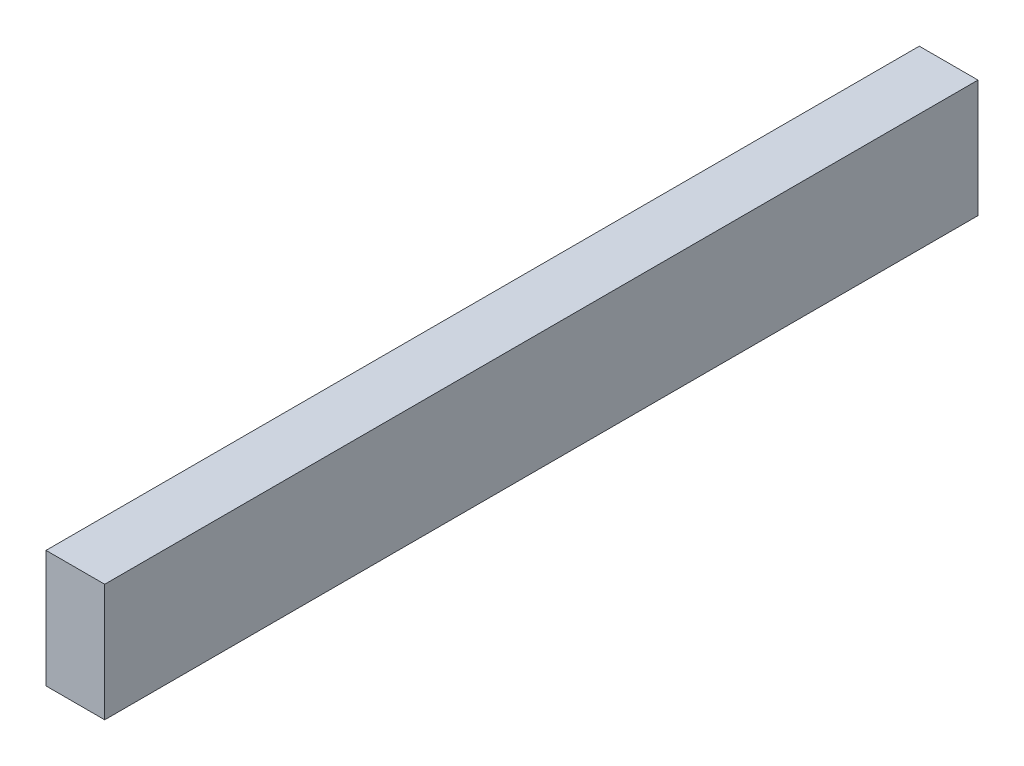
ISO-10303-21;
HEADER;
FILE_DESCRIPTION(('STEP AP214'),'2;1');
FILE_NAME('part.step','',(''),(''),'','','');
FILE_SCHEMA(('AUTOMOTIVE_DESIGN { 1 0 10303 214 1 1 1 1 }'));
ENDSEC;
DATA;
#1=APPLICATION_CONTEXT('core data for automotive mechanical design processes');
#2=APPLICATION_PROTOCOL_DEFINITION('international standard','automotive_design',2000,#1);
#3=PRODUCT_CONTEXT('',#1,'mechanical');
#4=PRODUCT('Part','Part','',(#3));
#5=PRODUCT_RELATED_PRODUCT_CATEGORY('part','',(#4));
#6=PRODUCT_DEFINITION_FORMATION('','',#4);
#7=PRODUCT_DEFINITION_CONTEXT('part definition',#1,'design');
#8=PRODUCT_DEFINITION('design','',#6,#7);
#9=PRODUCT_DEFINITION_SHAPE('','',#8);
#10=(LENGTH_UNIT() NAMED_UNIT(*) SI_UNIT(.MILLI.,.METRE.));
#11=(NAMED_UNIT(*) PLANE_ANGLE_UNIT() SI_UNIT($,.RADIAN.));
#12=(NAMED_UNIT(*) SI_UNIT($,.STERADIAN.) SOLID_ANGLE_UNIT());
#13=UNCERTAINTY_MEASURE_WITH_UNIT(LENGTH_MEASURE(1.E-05),#10,'distance_accuracy_value','');
#14=(GEOMETRIC_REPRESENTATION_CONTEXT(3) GLOBAL_UNCERTAINTY_ASSIGNED_CONTEXT((#13)) GLOBAL_UNIT_ASSIGNED_CONTEXT((#10,
#11,#12)) REPRESENTATION_CONTEXT('',''));
#15=CARTESIAN_POINT('',(0.,0.,0.));
#16=DIRECTION('',(0.,0.,1.));
#17=DIRECTION('',(1.,0.,0.));
#18=AXIS2_PLACEMENT_3D('',#15,#16,#17);
#19=CARTESIAN_POINT('',(25.4420449215706,-101.6,11.2462653159909));
#20=DIRECTION('',(1.,0.,0.));
#21=DIRECTION('',(0.,0.,-1.));
#22=AXIS2_PLACEMENT_3D('',#19,#20,#21);
#23=PLANE('',#22);
#24=DIRECTION('',(0.,0.,-1.));
#25=VECTOR('',#24,1.);
#26=CARTESIAN_POINT('',(25.4420449215706,0.,11.2462653159909));
#27=LINE('',#26,#25);
#28=CARTESIAN_POINT('',(25.4420449215706,0.,11.2462653159909));
#29=VERTEX_POINT('',#28);
#30=CARTESIAN_POINT('',(25.4420449215706,0.,-744.403734684009));
#31=VERTEX_POINT('',#30);
#32=EDGE_CURVE('E98',#29,#31,#27,.T.);
#33=ORIENTED_EDGE('',*,*,#32,.F.);
#34=DIRECTION('',(0.,1.,0.));
#35=VECTOR('',#34,1.);
#36=CARTESIAN_POINT('',(25.4420449215706,-101.6,11.2462653159909));
#37=LINE('',#36,#35);
#38=CARTESIAN_POINT('',(25.4420449215706,-101.6,11.2462653159909));
#39=VERTEX_POINT('',#38);
#40=EDGE_CURVE('E11',#39,#29,#37,.T.);
#41=ORIENTED_EDGE('',*,*,#40,.F.);
#42=DIRECTION('',(0.,0.,-1.));
#43=VECTOR('',#42,1.);
#44=CARTESIAN_POINT('',(25.4420449215706,-101.6,11.2462653159909));
#45=LINE('',#44,#43);
#46=CARTESIAN_POINT('',(25.4420449215706,-101.6,-744.403734684009));
#47=VERTEX_POINT('',#46);
#48=EDGE_CURVE('E92',#39,#47,#45,.T.);
#49=ORIENTED_EDGE('',*,*,#48,.T.);
#50=DIRECTION('',(0.,1.,0.));
#51=VECTOR('',#50,1.);
#52=CARTESIAN_POINT('',(25.4420449215706,-101.6,-744.403734684009));
#53=LINE('',#52,#51);
#54=EDGE_CURVE('E37',#47,#31,#53,.T.);
#55=ORIENTED_EDGE('',*,*,#54,.T.);
#56=EDGE_LOOP('',(#33,#41,#49,#55));
#57=FACE_BOUND('',#56,.T.);
#58=ADVANCED_FACE('F34',(#57),#23,.T.);
#59=CARTESIAN_POINT('',(-25.3579550784294,-101.6,11.2462653159909));
#60=DIRECTION('',(0.,0.,1.));
#61=DIRECTION('',(1.,0.,0.));
#62=AXIS2_PLACEMENT_3D('',#59,#60,#61);
#63=PLANE('',#62);
#64=DIRECTION('',(1.,0.,0.));
#65=VECTOR('',#64,1.);
#66=CARTESIAN_POINT('',(-25.3579550784294,0.,11.2462653159909));
#67=LINE('',#66,#65);
#68=CARTESIAN_POINT('',(-25.3579550784294,0.,11.2462653159909));
#69=VERTEX_POINT('',#68);
#70=EDGE_CURVE('E94',#69,#29,#67,.T.);
#71=ORIENTED_EDGE('',*,*,#70,.F.);
#72=DIRECTION('',(0.,1.,0.));
#73=VECTOR('',#72,1.);
#74=CARTESIAN_POINT('',(-25.3579550784294,-101.6,11.2462653159909));
#75=LINE('',#74,#73);
#76=CARTESIAN_POINT('',(-25.3579550784294,-101.6,11.2462653159909));
#77=VERTEX_POINT('',#76);
#78=EDGE_CURVE('E43',#77,#69,#75,.T.);
#79=ORIENTED_EDGE('',*,*,#78,.F.);
#80=DIRECTION('',(1.,0.,0.));
#81=VECTOR('',#80,1.);
#82=CARTESIAN_POINT('',(-25.3579550784294,-101.6,11.2462653159909));
#83=LINE('',#82,#81);
#84=EDGE_CURVE('E89',#77,#39,#83,.T.);
#85=ORIENTED_EDGE('',*,*,#84,.T.);
#86=ORIENTED_EDGE('',*,*,#40,.T.);
#87=EDGE_LOOP('',(#71,#79,#85,#86));
#88=FACE_BOUND('',#87,.T.);
#89=ADVANCED_FACE('F108',(#88),#63,.T.);
#90=CARTESIAN_POINT('',(-25.3579550784294,-101.6,11.2462653159909));
#91=DIRECTION('',(-1.,0.,0.));
#92=DIRECTION('',(0.,0.,1.));
#93=AXIS2_PLACEMENT_3D('',#90,#91,#92);
#94=PLANE('',#93);
#95=DIRECTION('',(0.,0.,1.));
#96=VECTOR('',#95,1.);
#97=CARTESIAN_POINT('',(-25.3579550784294,0.,11.2462653159909));
#98=LINE('',#97,#96);
#99=CARTESIAN_POINT('',(-25.3579550784294,0.,-744.403734684009));
#100=VERTEX_POINT('',#99);
#101=EDGE_CURVE('E84',#100,#69,#98,.T.);
#102=ORIENTED_EDGE('',*,*,#101,.F.);
#103=DIRECTION('',(0.,1.,0.));
#104=VECTOR('',#103,1.);
#105=CARTESIAN_POINT('',(-25.3579550784294,-101.6,-744.403734684009));
#106=LINE('',#105,#104);
#107=CARTESIAN_POINT('',(-25.3579550784294,-101.6,-744.403734684009));
#108=VERTEX_POINT('',#107);
#109=EDGE_CURVE('E79',#108,#100,#106,.T.);
#110=ORIENTED_EDGE('',*,*,#109,.F.);
#111=DIRECTION('',(0.,0.,1.));
#112=VECTOR('',#111,1.);
#113=CARTESIAN_POINT('',(-25.3579550784294,-101.6,11.2462653159909));
#114=LINE('',#113,#112);
#115=EDGE_CURVE('E82',#108,#77,#114,.T.);
#116=ORIENTED_EDGE('',*,*,#115,.T.);
#117=ORIENTED_EDGE('',*,*,#78,.T.);
#118=EDGE_LOOP('',(#102,#110,#116,#117));
#119=FACE_BOUND('',#118,.T.);
#120=ADVANCED_FACE('F81',(#119),#94,.T.);
#121=CARTESIAN_POINT('',(-25.3579550784294,-101.6,-744.403734684009));
#122=DIRECTION('',(0.,0.,-1.));
#123=DIRECTION('',(-1.,0.,0.));
#124=AXIS2_PLACEMENT_3D('',#121,#122,#123);
#125=PLANE('',#124);
#126=DIRECTION('',(-1.,0.,0.));
#127=VECTOR('',#126,1.);
#128=CARTESIAN_POINT('',(-25.3579550784294,0.,-744.403734684009));
#129=LINE('',#128,#127);
#130=EDGE_CURVE('E101',#31,#100,#129,.T.);
#131=ORIENTED_EDGE('',*,*,#130,.F.);
#132=ORIENTED_EDGE('',*,*,#54,.F.);
#133=DIRECTION('',(-1.,0.,0.));
#134=VECTOR('',#133,1.);
#135=CARTESIAN_POINT('',(-25.3579550784294,-101.6,-744.403734684009));
#136=LINE('',#135,#134);
#137=EDGE_CURVE('E88',#47,#108,#136,.T.);
#138=ORIENTED_EDGE('',*,*,#137,.T.);
#139=ORIENTED_EDGE('',*,*,#109,.T.);
#140=EDGE_LOOP('',(#131,#132,#138,#139));
#141=FACE_BOUND('',#140,.T.);
#142=ADVANCED_FACE('F91',(#141),#125,.T.);
#143=CARTESIAN_POINT('',(0.,-101.6,0.));
#144=DIRECTION('',(0.,-1.,0.));
#145=DIRECTION('',(0.,0.,-1.));
#146=AXIS2_PLACEMENT_3D('',#143,#144,#145);
#147=PLANE('',#146);
#148=ORIENTED_EDGE('',*,*,#48,.F.);
#149=ORIENTED_EDGE('',*,*,#84,.F.);
#150=ORIENTED_EDGE('',*,*,#115,.F.);
#151=ORIENTED_EDGE('',*,*,#137,.F.);
#152=EDGE_LOOP('',(#148,#149,#150,#151));
#153=FACE_BOUND('',#152,.T.);
#154=ADVANCED_FACE('F87',(#153),#147,.T.);
#155=CARTESIAN_POINT('',(0.,0.,0.));
#156=DIRECTION('',(0.,-1.,0.));
#157=DIRECTION('',(0.,0.,-1.));
#158=AXIS2_PLACEMENT_3D('',#155,#156,#157);
#159=PLANE('',#158);
#160=ORIENTED_EDGE('',*,*,#32,.T.);
#161=ORIENTED_EDGE('',*,*,#130,.T.);
#162=ORIENTED_EDGE('',*,*,#101,.T.);
#163=ORIENTED_EDGE('',*,*,#70,.T.);
#164=EDGE_LOOP('',(#160,#161,#162,#163));
#165=FACE_BOUND('',#164,.T.);
#166=ADVANCED_FACE('F107',(#165),#159,.F.);
#167=CLOSED_SHELL('',(#58,#89,#120,#142,#154,#166));
#168=MANIFOLD_SOLID_BREP('B2',#167);
#169=ADVANCED_BREP_SHAPE_REPRESENTATION('',(#18,#168),#14);
#170=SHAPE_DEFINITION_REPRESENTATION(#9,#169);
ENDSEC;
END-ISO-10303-21;
